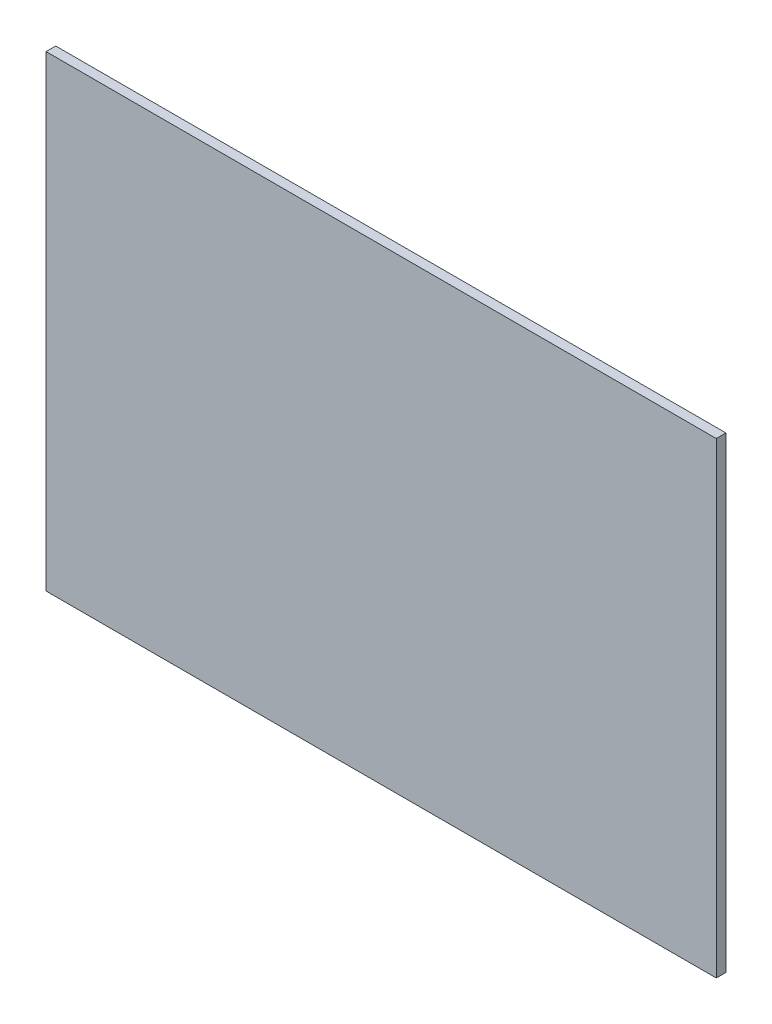
ISO-10303-21;
HEADER;
FILE_DESCRIPTION(('STEP AP214'),'2;1');
FILE_NAME('part.step','',(''),(''),'','','');
FILE_SCHEMA(('AUTOMOTIVE_DESIGN { 1 0 10303 214 1 1 1 1 }'));
ENDSEC;
DATA;
#1=APPLICATION_CONTEXT('core data for automotive mechanical design processes');
#2=APPLICATION_PROTOCOL_DEFINITION('international standard','automotive_design',2000,#1);
#3=PRODUCT_CONTEXT('',#1,'mechanical');
#4=PRODUCT('Part','Part','',(#3));
#5=PRODUCT_RELATED_PRODUCT_CATEGORY('part','',(#4));
#6=PRODUCT_DEFINITION_FORMATION('','',#4);
#7=PRODUCT_DEFINITION_CONTEXT('part definition',#1,'design');
#8=PRODUCT_DEFINITION('design','',#6,#7);
#9=PRODUCT_DEFINITION_SHAPE('','',#8);
#10=(LENGTH_UNIT() NAMED_UNIT(*) SI_UNIT(.MILLI.,.METRE.));
#11=(NAMED_UNIT(*) PLANE_ANGLE_UNIT() SI_UNIT($,.RADIAN.));
#12=(NAMED_UNIT(*) SI_UNIT($,.STERADIAN.) SOLID_ANGLE_UNIT());
#13=UNCERTAINTY_MEASURE_WITH_UNIT(LENGTH_MEASURE(1.E-05),#10,'distance_accuracy_value','');
#14=(GEOMETRIC_REPRESENTATION_CONTEXT(3) GLOBAL_UNCERTAINTY_ASSIGNED_CONTEXT((#13)) GLOBAL_UNIT_ASSIGNED_CONTEXT((#10,
#11,#12)) REPRESENTATION_CONTEXT('',''));
#15=CARTESIAN_POINT('',(0.,0.,0.));
#16=DIRECTION('',(0.,0.,1.));
#17=DIRECTION('',(1.,0.,0.));
#18=AXIS2_PLACEMENT_3D('',#15,#16,#17);
#19=CARTESIAN_POINT('',(-95.5677148900169,99.5185279187817,3.));
#20=DIRECTION('',(1.,0.,0.));
#21=DIRECTION('',(0.,0.,-1.));
#22=AXIS2_PLACEMENT_3D('',#19,#20,#21);
#23=PLANE('',#22);
#24=DIRECTION('',(0.,-1.,0.));
#25=VECTOR('',#24,1.);
#26=CARTESIAN_POINT('',(-95.5677148900169,99.5185279187817,0.));
#27=LINE('',#26,#25);
#28=CARTESIAN_POINT('',(-95.5677148900169,99.5185279187817,0.));
#29=VERTEX_POINT('',#28);
#30=CARTESIAN_POINT('',(-95.5677148900169,-45.4814720812183,0.));
#31=VERTEX_POINT('',#30);
#32=EDGE_CURVE('E96',#29,#31,#27,.T.);
#33=ORIENTED_EDGE('',*,*,#32,.T.);
#34=DIRECTION('',(0.,0.,-1.));
#35=VECTOR('',#34,1.);
#36=CARTESIAN_POINT('',(-95.5677148900169,-45.4814720812183,3.));
#37=LINE('',#36,#35);
#38=CARTESIAN_POINT('',(-95.5677148900169,-45.4814720812183,3.));
#39=VERTEX_POINT('',#38);
#40=EDGE_CURVE('E11',#39,#31,#37,.T.);
#41=ORIENTED_EDGE('',*,*,#40,.F.);
#42=DIRECTION('',(0.,-1.,0.));
#43=VECTOR('',#42,1.);
#44=CARTESIAN_POINT('',(-95.5677148900169,99.5185279187817,3.));
#45=LINE('',#44,#43);
#46=CARTESIAN_POINT('',(-95.5677148900169,99.5185279187817,3.));
#47=VERTEX_POINT('',#46);
#48=EDGE_CURVE('E84',#47,#39,#45,.T.);
#49=ORIENTED_EDGE('',*,*,#48,.F.);
#50=DIRECTION('',(0.,0.,-1.));
#51=VECTOR('',#50,1.);
#52=CARTESIAN_POINT('',(-95.5677148900169,99.5185279187817,3.));
#53=LINE('',#52,#51);
#54=EDGE_CURVE('E92',#47,#29,#53,.T.);
#55=ORIENTED_EDGE('',*,*,#54,.T.);
#56=EDGE_LOOP('',(#33,#41,#49,#55));
#57=FACE_BOUND('',#56,.T.);
#58=ADVANCED_FACE('F33',(#57),#23,.F.);
#59=CARTESIAN_POINT('',(-95.5677148900169,-45.4814720812183,3.));
#60=DIRECTION('',(0.,1.,0.));
#61=DIRECTION('',(0.,0.,1.));
#62=AXIS2_PLACEMENT_3D('',#59,#60,#61);
#63=PLANE('',#62);
#64=DIRECTION('',(1.,0.,0.));
#65=VECTOR('',#64,1.);
#66=CARTESIAN_POINT('',(-95.5677148900169,-45.4814720812183,0.));
#67=LINE('',#66,#65);
#68=CARTESIAN_POINT('',(112.432285109983,-45.4814720812183,0.));
#69=VERTEX_POINT('',#68);
#70=EDGE_CURVE('E88',#31,#69,#67,.T.);
#71=ORIENTED_EDGE('',*,*,#70,.T.);
#72=DIRECTION('',(0.,0.,-1.));
#73=VECTOR('',#72,1.);
#74=CARTESIAN_POINT('',(112.432285109983,-45.4814720812183,3.));
#75=LINE('',#74,#73);
#76=CARTESIAN_POINT('',(112.432285109983,-45.4814720812183,3.));
#77=VERTEX_POINT('',#76);
#78=EDGE_CURVE('E41',#77,#69,#75,.T.);
#79=ORIENTED_EDGE('',*,*,#78,.F.);
#80=DIRECTION('',(1.,0.,0.));
#81=VECTOR('',#80,1.);
#82=CARTESIAN_POINT('',(-95.5677148900169,-45.4814720812183,3.));
#83=LINE('',#82,#81);
#84=EDGE_CURVE('E79',#39,#77,#83,.T.);
#85=ORIENTED_EDGE('',*,*,#84,.F.);
#86=ORIENTED_EDGE('',*,*,#40,.T.);
#87=EDGE_LOOP('',(#71,#79,#85,#86));
#88=FACE_BOUND('',#87,.T.);
#89=ADVANCED_FACE('F87',(#88),#63,.F.);
#90=CARTESIAN_POINT('',(112.432285109983,99.5185279187817,3.));
#91=DIRECTION('',(-1.,0.,0.));
#92=DIRECTION('',(0.,-1.,0.));
#93=AXIS2_PLACEMENT_3D('',#90,#91,#92);
#94=PLANE('',#93);
#95=DIRECTION('',(0.,1.,0.));
#96=VECTOR('',#95,1.);
#97=CARTESIAN_POINT('',(112.432285109983,99.5185279187817,0.));
#98=LINE('',#97,#96);
#99=CARTESIAN_POINT('',(112.432285109983,99.5185279187817,0.));
#100=VERTEX_POINT('',#99);
#101=EDGE_CURVE('E66',#69,#100,#98,.T.);
#102=ORIENTED_EDGE('',*,*,#101,.T.);
#103=DIRECTION('',(0.,0.,-1.));
#104=VECTOR('',#103,1.);
#105=CARTESIAN_POINT('',(112.432285109983,99.5185279187817,3.));
#106=LINE('',#105,#104);
#107=CARTESIAN_POINT('',(112.432285109983,99.5185279187817,3.));
#108=VERTEX_POINT('',#107);
#109=EDGE_CURVE('E89',#108,#100,#106,.T.);
#110=ORIENTED_EDGE('',*,*,#109,.F.);
#111=DIRECTION('',(0.,1.,0.));
#112=VECTOR('',#111,1.);
#113=CARTESIAN_POINT('',(112.432285109983,99.5185279187817,3.));
#114=LINE('',#113,#112);
#115=EDGE_CURVE('E82',#77,#108,#114,.T.);
#116=ORIENTED_EDGE('',*,*,#115,.F.);
#117=ORIENTED_EDGE('',*,*,#78,.T.);
#118=EDGE_LOOP('',(#102,#110,#116,#117));
#119=FACE_BOUND('',#118,.T.);
#120=ADVANCED_FACE('F90',(#119),#94,.F.);
#121=CARTESIAN_POINT('',(-95.5677148900169,99.5185279187817,3.));
#122=DIRECTION('',(0.,-1.,0.));
#123=DIRECTION('',(0.,0.,-1.));
#124=AXIS2_PLACEMENT_3D('',#121,#122,#123);
#125=PLANE('',#124);
#126=DIRECTION('',(-1.,0.,0.));
#127=VECTOR('',#126,1.);
#128=CARTESIAN_POINT('',(-95.5677148900169,99.5185279187817,0.));
#129=LINE('',#128,#127);
#130=EDGE_CURVE('E72',#100,#29,#129,.T.);
#131=ORIENTED_EDGE('',*,*,#130,.T.);
#132=ORIENTED_EDGE('',*,*,#54,.F.);
#133=DIRECTION('',(-1.,0.,0.));
#134=VECTOR('',#133,1.);
#135=CARTESIAN_POINT('',(-95.5677148900169,99.5185279187817,3.));
#136=LINE('',#135,#134);
#137=EDGE_CURVE('E49',#108,#47,#136,.T.);
#138=ORIENTED_EDGE('',*,*,#137,.F.);
#139=ORIENTED_EDGE('',*,*,#109,.T.);
#140=EDGE_LOOP('',(#131,#132,#138,#139));
#141=FACE_BOUND('',#140,.T.);
#142=ADVANCED_FACE('F103',(#141),#125,.F.);
#143=CARTESIAN_POINT('',(0.,0.,3.));
#144=DIRECTION('',(0.,0.,1.));
#145=DIRECTION('',(1.,0.,0.));
#146=AXIS2_PLACEMENT_3D('',#143,#144,#145);
#147=PLANE('',#146);
#148=ORIENTED_EDGE('',*,*,#48,.T.);
#149=ORIENTED_EDGE('',*,*,#84,.T.);
#150=ORIENTED_EDGE('',*,*,#115,.T.);
#151=ORIENTED_EDGE('',*,*,#137,.T.);
#152=EDGE_LOOP('',(#148,#149,#150,#151));
#153=FACE_BOUND('',#152,.T.);
#154=ADVANCED_FACE('F80',(#153),#147,.T.);
#155=CARTESIAN_POINT('',(0.,0.,0.));
#156=DIRECTION('',(0.,0.,1.));
#157=DIRECTION('',(1.,0.,0.));
#158=AXIS2_PLACEMENT_3D('',#155,#156,#157);
#159=PLANE('',#158);
#160=ORIENTED_EDGE('',*,*,#32,.F.);
#161=ORIENTED_EDGE('',*,*,#130,.F.);
#162=ORIENTED_EDGE('',*,*,#101,.F.);
#163=ORIENTED_EDGE('',*,*,#70,.F.);
#164=EDGE_LOOP('',(#160,#161,#162,#163));
#165=FACE_BOUND('',#164,.T.);
#166=ADVANCED_FACE('F106',(#165),#159,.F.);
#167=CLOSED_SHELL('',(#58,#89,#120,#142,#154,#166));
#168=MANIFOLD_SOLID_BREP('B2',#167);
#169=ADVANCED_BREP_SHAPE_REPRESENTATION('',(#18,#168),#14);
#170=SHAPE_DEFINITION_REPRESENTATION(#9,#169);
ENDSEC;
END-ISO-10303-21;
